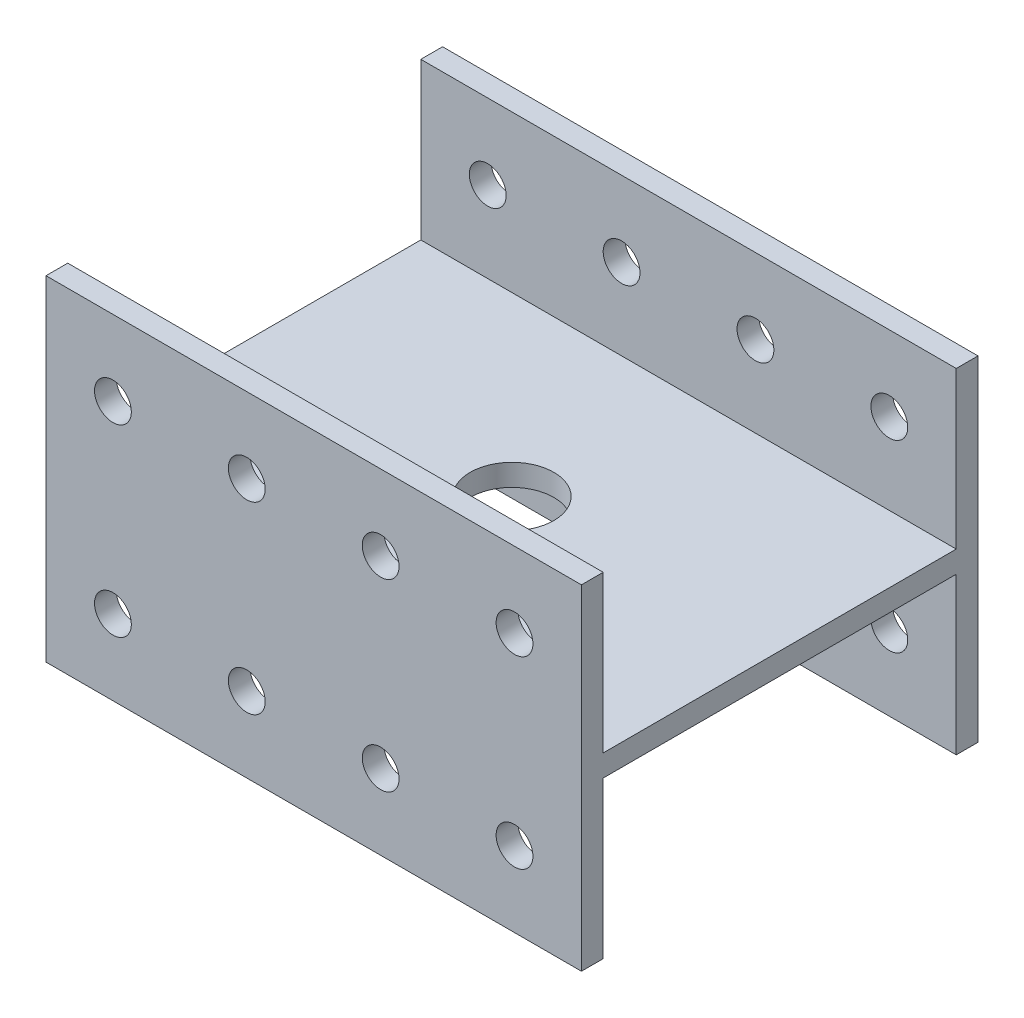
ISO-10303-21;
HEADER;
FILE_DESCRIPTION(('STEP AP214'),'2;1');
FILE_NAME('part.step','',(''),(''),'','','');
FILE_SCHEMA(('AUTOMOTIVE_DESIGN { 1 0 10303 214 1 1 1 1 }'));
ENDSEC;
DATA;
#1=APPLICATION_CONTEXT('core data for automotive mechanical design processes');
#2=APPLICATION_PROTOCOL_DEFINITION('international standard','automotive_design',2000,#1);
#3=PRODUCT_CONTEXT('',#1,'mechanical');
#4=PRODUCT('Part','Part','',(#3));
#5=PRODUCT_RELATED_PRODUCT_CATEGORY('part','',(#4));
#6=PRODUCT_DEFINITION_FORMATION('','',#4);
#7=PRODUCT_DEFINITION_CONTEXT('part definition',#1,'design');
#8=PRODUCT_DEFINITION('design','',#6,#7);
#9=PRODUCT_DEFINITION_SHAPE('','',#8);
#10=(LENGTH_UNIT() NAMED_UNIT(*) SI_UNIT(.MILLI.,.METRE.));
#11=(NAMED_UNIT(*) PLANE_ANGLE_UNIT() SI_UNIT($,.RADIAN.));
#12=(NAMED_UNIT(*) SI_UNIT($,.STERADIAN.) SOLID_ANGLE_UNIT());
#13=UNCERTAINTY_MEASURE_WITH_UNIT(LENGTH_MEASURE(1.E-05),#10,'distance_accuracy_value','');
#14=(GEOMETRIC_REPRESENTATION_CONTEXT(3) GLOBAL_UNCERTAINTY_ASSIGNED_CONTEXT((#13)) GLOBAL_UNIT_ASSIGNED_CONTEXT((#10,
#11,#12)) REPRESENTATION_CONTEXT('',''));
#15=CARTESIAN_POINT('',(0.,0.,0.));
#16=DIRECTION('',(0.,0.,1.));
#17=DIRECTION('',(1.,0.,0.));
#18=AXIS2_PLACEMENT_3D('',#15,#16,#17);
#19=CARTESIAN_POINT('',(0.,0.,237.));
#20=DIRECTION('',(0.,1.,0.));
#21=DIRECTION('',(0.,0.,1.));
#22=AXIS2_PLACEMENT_3D('',#19,#20,#21);
#23=PLANE('',#22);
#24=DIRECTION('',(0.,0.,-1.));
#25=VECTOR('',#24,1.);
#26=CARTESIAN_POINT('',(320.,0.,237.));
#27=LINE('',#26,#25);
#28=CARTESIAN_POINT('',(320.,0.,13.));
#29=VERTEX_POINT('',#28);
#30=CARTESIAN_POINT('',(320.,0.,0.));
#31=VERTEX_POINT('',#30);
#32=EDGE_CURVE('E138',#29,#31,#27,.T.);
#33=ORIENTED_EDGE('',*,*,#32,.F.);
#34=DIRECTION('',(-1.,0.,0.));
#35=VECTOR('',#34,1.);
#36=CARTESIAN_POINT('',(320.,0.,13.));
#37=LINE('',#36,#35);
#38=CARTESIAN_POINT('',(0.,0.,13.));
#39=VERTEX_POINT('',#38);
#40=EDGE_CURVE('E123',#29,#39,#37,.T.);
#41=ORIENTED_EDGE('',*,*,#40,.T.);
#42=DIRECTION('',(0.,0.,-1.));
#43=VECTOR('',#42,1.);
#44=CARTESIAN_POINT('',(0.,0.,237.));
#45=LINE('',#44,#43);
#46=CARTESIAN_POINT('',(0.,0.,0.));
#47=VERTEX_POINT('',#46);
#48=EDGE_CURVE('E151',#39,#47,#45,.T.);
#49=ORIENTED_EDGE('',*,*,#48,.T.);
#50=DIRECTION('',(1.,0.,0.));
#51=VECTOR('',#50,1.);
#52=CARTESIAN_POINT('',(0.,0.,0.));
#53=LINE('',#52,#51);
#54=EDGE_CURVE('E145',#47,#31,#53,.T.);
#55=ORIENTED_EDGE('',*,*,#54,.T.);
#56=EDGE_LOOP('',(#33,#41,#49,#55));
#57=FACE_BOUND('',#56,.T.);
#58=ADVANCED_FACE('F32',(#57),#23,.F.);
#59=CARTESIAN_POINT('',(40.,45.,0.));
#60=DIRECTION('',(0.,0.,1.));
#61=DIRECTION('',(1.,0.,0.));
#62=AXIS2_PLACEMENT_3D('',#59,#60,#61);
#63=CYLINDRICAL_SURFACE('',#62,11.);
#64=CARTESIAN_POINT('',(40.,45.,13.));
#65=DIRECTION('',(0.,0.,-1.));
#66=DIRECTION('',(-1.,0.,0.));
#67=AXIS2_PLACEMENT_3D('',#64,#65,#66);
#68=CIRCLE('',#67,11.);
#69=CARTESIAN_POINT('',(29.,45.,13.));
#70=VERTEX_POINT('',#69);
#71=EDGE_CURVE('E226',#70,#70,#68,.F.);
#72=ORIENTED_EDGE('',*,*,#71,.T.);
#73=EDGE_LOOP('',(#72));
#74=FACE_BOUND('',#73,.T.);
#75=CARTESIAN_POINT('',(40.,45.,0.));
#76=DIRECTION('',(0.,0.,1.));
#77=DIRECTION('',(1.,0.,0.));
#78=AXIS2_PLACEMENT_3D('',#75,#76,#77);
#79=CIRCLE('',#78,11.);
#80=CARTESIAN_POINT('',(51.,45.,0.));
#81=VERTEX_POINT('',#80);
#82=EDGE_CURVE('E274',#81,#81,#79,.T.);
#83=ORIENTED_EDGE('',*,*,#82,.F.);
#84=EDGE_LOOP('',(#83));
#85=FACE_BOUND('',#84,.T.);
#86=ADVANCED_FACE('F368',(#74,#85),#63,.F.);
#87=CARTESIAN_POINT('',(120.,45.,0.));
#88=DIRECTION('',(0.,0.,1.));
#89=DIRECTION('',(1.,0.,0.));
#90=AXIS2_PLACEMENT_3D('',#87,#88,#89);
#91=CYLINDRICAL_SURFACE('',#90,11.);
#92=CARTESIAN_POINT('',(120.,45.,13.));
#93=DIRECTION('',(0.,0.,-1.));
#94=DIRECTION('',(-1.,0.,0.));
#95=AXIS2_PLACEMENT_3D('',#92,#93,#94);
#96=CIRCLE('',#95,11.);
#97=CARTESIAN_POINT('',(109.,45.,13.));
#98=VERTEX_POINT('',#97);
#99=EDGE_CURVE('E213',#98,#98,#96,.F.);
#100=ORIENTED_EDGE('',*,*,#99,.T.);
#101=EDGE_LOOP('',(#100));
#102=FACE_BOUND('',#101,.T.);
#103=CARTESIAN_POINT('',(120.,45.,0.));
#104=DIRECTION('',(0.,0.,1.));
#105=DIRECTION('',(1.,0.,0.));
#106=AXIS2_PLACEMENT_3D('',#103,#104,#105);
#107=CIRCLE('',#106,11.);
#108=CARTESIAN_POINT('',(131.,45.,0.));
#109=VERTEX_POINT('',#108);
#110=EDGE_CURVE('E267',#109,#109,#107,.T.);
#111=ORIENTED_EDGE('',*,*,#110,.F.);
#112=EDGE_LOOP('',(#111));
#113=FACE_BOUND('',#112,.T.);
#114=ADVANCED_FACE('F373',(#102,#113),#91,.F.);
#115=CARTESIAN_POINT('',(200.,45.,0.));
#116=DIRECTION('',(0.,0.,1.));
#117=DIRECTION('',(1.,0.,0.));
#118=AXIS2_PLACEMENT_3D('',#115,#116,#117);
#119=CYLINDRICAL_SURFACE('',#118,11.);
#120=CARTESIAN_POINT('',(200.,45.,13.));
#121=DIRECTION('',(0.,0.,-1.));
#122=DIRECTION('',(-1.,0.,0.));
#123=AXIS2_PLACEMENT_3D('',#120,#121,#122);
#124=CIRCLE('',#123,11.);
#125=CARTESIAN_POINT('',(189.,45.,13.));
#126=VERTEX_POINT('',#125);
#127=EDGE_CURVE('E208',#126,#126,#124,.F.);
#128=ORIENTED_EDGE('',*,*,#127,.T.);
#129=EDGE_LOOP('',(#128));
#130=FACE_BOUND('',#129,.T.);
#131=CARTESIAN_POINT('',(200.,45.,0.));
#132=DIRECTION('',(0.,0.,1.));
#133=DIRECTION('',(1.,0.,0.));
#134=AXIS2_PLACEMENT_3D('',#131,#132,#133);
#135=CIRCLE('',#134,11.);
#136=CARTESIAN_POINT('',(211.,45.,0.));
#137=VERTEX_POINT('',#136);
#138=EDGE_CURVE('E160',#137,#137,#135,.T.);
#139=ORIENTED_EDGE('',*,*,#138,.F.);
#140=EDGE_LOOP('',(#139));
#141=FACE_BOUND('',#140,.T.);
#142=ADVANCED_FACE('F395',(#130,#141),#119,.F.);
#143=CARTESIAN_POINT('',(280.,45.,0.));
#144=DIRECTION('',(0.,0.,1.));
#145=DIRECTION('',(1.,0.,0.));
#146=AXIS2_PLACEMENT_3D('',#143,#144,#145);
#147=CYLINDRICAL_SURFACE('',#146,11.);
#148=CARTESIAN_POINT('',(280.,45.,13.));
#149=DIRECTION('',(0.,0.,-1.));
#150=DIRECTION('',(-1.,0.,0.));
#151=AXIS2_PLACEMENT_3D('',#148,#149,#150);
#152=CIRCLE('',#151,11.);
#153=CARTESIAN_POINT('',(269.,45.,13.));
#154=VERTEX_POINT('',#153);
#155=EDGE_CURVE('E206',#154,#154,#152,.F.);
#156=ORIENTED_EDGE('',*,*,#155,.T.);
#157=EDGE_LOOP('',(#156));
#158=FACE_BOUND('',#157,.T.);
#159=CARTESIAN_POINT('',(280.,45.,0.));
#160=DIRECTION('',(0.,0.,1.));
#161=DIRECTION('',(1.,0.,0.));
#162=AXIS2_PLACEMENT_3D('',#159,#160,#161);
#163=CIRCLE('',#162,11.);
#164=CARTESIAN_POINT('',(291.,45.,0.));
#165=VERTEX_POINT('',#164);
#166=EDGE_CURVE('E166',#165,#165,#163,.T.);
#167=ORIENTED_EDGE('',*,*,#166,.F.);
#168=EDGE_LOOP('',(#167));
#169=FACE_BOUND('',#168,.T.);
#170=ADVANCED_FACE('F400',(#158,#169),#147,.F.);
#171=CARTESIAN_POINT('',(0.,200.,237.));
#172=DIRECTION('',(0.,-1.,0.));
#173=DIRECTION('',(0.,0.,-1.));
#174=AXIS2_PLACEMENT_3D('',#171,#172,#173);
#175=PLANE('',#174);
#176=DIRECTION('',(0.,0.,-1.));
#177=VECTOR('',#176,1.);
#178=CARTESIAN_POINT('',(0.,200.,237.));
#179=LINE('',#178,#177);
#180=CARTESIAN_POINT('',(0.,200.,13.));
#181=VERTEX_POINT('',#180);
#182=CARTESIAN_POINT('',(0.,200.,0.));
#183=VERTEX_POINT('',#182);
#184=EDGE_CURVE('E290',#181,#183,#179,.T.);
#185=ORIENTED_EDGE('',*,*,#184,.F.);
#186=DIRECTION('',(-1.,0.,0.));
#187=VECTOR('',#186,1.);
#188=CARTESIAN_POINT('',(320.,200.,13.));
#189=LINE('',#188,#187);
#190=CARTESIAN_POINT('',(320.,200.,13.));
#191=VERTEX_POINT('',#190);
#192=EDGE_CURVE('E196',#191,#181,#189,.T.);
#193=ORIENTED_EDGE('',*,*,#192,.F.);
#194=DIRECTION('',(0.,0.,-1.));
#195=VECTOR('',#194,1.);
#196=CARTESIAN_POINT('',(320.,200.,237.));
#197=LINE('',#196,#195);
#198=CARTESIAN_POINT('',(320.,200.,0.));
#199=VERTEX_POINT('',#198);
#200=EDGE_CURVE('E153',#191,#199,#197,.T.);
#201=ORIENTED_EDGE('',*,*,#200,.T.);
#202=DIRECTION('',(-1.,0.,0.));
#203=VECTOR('',#202,1.);
#204=CARTESIAN_POINT('',(0.,200.,0.));
#205=LINE('',#204,#203);
#206=EDGE_CURVE('E284',#199,#183,#205,.T.);
#207=ORIENTED_EDGE('',*,*,#206,.T.);
#208=EDGE_LOOP('',(#185,#193,#201,#207));
#209=FACE_BOUND('',#208,.T.);
#210=ADVANCED_FACE('F310',(#209),#175,.F.);
#211=CARTESIAN_POINT('',(40.,155.,0.));
#212=DIRECTION('',(0.,0.,1.));
#213=DIRECTION('',(1.,0.,0.));
#214=AXIS2_PLACEMENT_3D('',#211,#212,#213);
#215=CYLINDRICAL_SURFACE('',#214,11.);
#216=CARTESIAN_POINT('',(40.,155.,13.));
#217=DIRECTION('',(0.,0.,-1.));
#218=DIRECTION('',(0.,1.,0.));
#219=AXIS2_PLACEMENT_3D('',#216,#217,#218);
#220=CIRCLE('',#219,11.);
#221=CARTESIAN_POINT('',(40.,166.,13.));
#222=VERTEX_POINT('',#221);
#223=EDGE_CURVE('E264',#222,#222,#220,.F.);
#224=ORIENTED_EDGE('',*,*,#223,.T.);
#225=EDGE_LOOP('',(#224));
#226=FACE_BOUND('',#225,.T.);
#227=CARTESIAN_POINT('',(40.,155.,0.));
#228=DIRECTION('',(0.,0.,1.));
#229=DIRECTION('',(1.,0.,0.));
#230=AXIS2_PLACEMENT_3D('',#227,#228,#229);
#231=CIRCLE('',#230,11.);
#232=CARTESIAN_POINT('',(51.,155.,0.));
#233=VERTEX_POINT('',#232);
#234=EDGE_CURVE('E172',#233,#233,#231,.T.);
#235=ORIENTED_EDGE('',*,*,#234,.F.);
#236=EDGE_LOOP('',(#235));
#237=FACE_BOUND('',#236,.T.);
#238=ADVANCED_FACE('F405',(#226,#237),#215,.F.);
#239=CARTESIAN_POINT('',(120.,155.,0.));
#240=DIRECTION('',(0.,0.,1.));
#241=DIRECTION('',(1.,0.,0.));
#242=AXIS2_PLACEMENT_3D('',#239,#240,#241);
#243=CYLINDRICAL_SURFACE('',#242,11.);
#244=CARTESIAN_POINT('',(120.,155.,13.));
#245=DIRECTION('',(0.,0.,-1.));
#246=DIRECTION('',(0.,1.,0.));
#247=AXIS2_PLACEMENT_3D('',#244,#245,#246);
#248=CIRCLE('',#247,11.);
#249=CARTESIAN_POINT('',(120.,166.,13.));
#250=VERTEX_POINT('',#249);
#251=EDGE_CURVE('E261',#250,#250,#248,.F.);
#252=ORIENTED_EDGE('',*,*,#251,.T.);
#253=EDGE_LOOP('',(#252));
#254=FACE_BOUND('',#253,.T.);
#255=CARTESIAN_POINT('',(120.,155.,0.));
#256=DIRECTION('',(0.,0.,1.));
#257=DIRECTION('',(1.,0.,0.));
#258=AXIS2_PLACEMENT_3D('',#255,#256,#257);
#259=CIRCLE('',#258,11.);
#260=CARTESIAN_POINT('',(131.,155.,0.));
#261=VERTEX_POINT('',#260);
#262=EDGE_CURVE('E178',#261,#261,#259,.T.);
#263=ORIENTED_EDGE('',*,*,#262,.F.);
#264=EDGE_LOOP('',(#263));
#265=FACE_BOUND('',#264,.T.);
#266=ADVANCED_FACE('F409',(#254,#265),#243,.F.);
#267=CARTESIAN_POINT('',(200.,155.,0.));
#268=DIRECTION('',(0.,0.,1.));
#269=DIRECTION('',(1.,0.,0.));
#270=AXIS2_PLACEMENT_3D('',#267,#268,#269);
#271=CYLINDRICAL_SURFACE('',#270,11.);
#272=CARTESIAN_POINT('',(200.,155.,13.));
#273=DIRECTION('',(0.,0.,-1.));
#274=DIRECTION('',(0.,1.,0.));
#275=AXIS2_PLACEMENT_3D('',#272,#273,#274);
#276=CIRCLE('',#275,11.);
#277=CARTESIAN_POINT('',(200.,166.,13.));
#278=VERTEX_POINT('',#277);
#279=EDGE_CURVE('E200',#278,#278,#276,.F.);
#280=ORIENTED_EDGE('',*,*,#279,.T.);
#281=EDGE_LOOP('',(#280));
#282=FACE_BOUND('',#281,.T.);
#283=CARTESIAN_POINT('',(200.,155.,0.));
#284=DIRECTION('',(0.,0.,1.));
#285=DIRECTION('',(1.,0.,0.));
#286=AXIS2_PLACEMENT_3D('',#283,#284,#285);
#287=CIRCLE('',#286,11.);
#288=CARTESIAN_POINT('',(211.,155.,0.));
#289=VERTEX_POINT('',#288);
#290=EDGE_CURVE('E184',#289,#289,#287,.T.);
#291=ORIENTED_EDGE('',*,*,#290,.F.);
#292=EDGE_LOOP('',(#291));
#293=FACE_BOUND('',#292,.T.);
#294=ADVANCED_FACE('F388',(#282,#293),#271,.F.);
#295=CARTESIAN_POINT('',(280.,155.,0.));
#296=DIRECTION('',(0.,0.,1.));
#297=DIRECTION('',(1.,0.,0.));
#298=AXIS2_PLACEMENT_3D('',#295,#296,#297);
#299=CYLINDRICAL_SURFACE('',#298,11.);
#300=CARTESIAN_POINT('',(280.,155.,13.));
#301=DIRECTION('',(0.,0.,-1.));
#302=DIRECTION('',(0.,1.,0.));
#303=AXIS2_PLACEMENT_3D('',#300,#301,#302);
#304=CIRCLE('',#303,11.);
#305=CARTESIAN_POINT('',(280.,166.,13.));
#306=VERTEX_POINT('',#305);
#307=EDGE_CURVE('E197',#306,#306,#304,.F.);
#308=ORIENTED_EDGE('',*,*,#307,.T.);
#309=EDGE_LOOP('',(#308));
#310=FACE_BOUND('',#309,.T.);
#311=CARTESIAN_POINT('',(280.,155.,0.));
#312=DIRECTION('',(0.,0.,1.));
#313=DIRECTION('',(1.,0.,0.));
#314=AXIS2_PLACEMENT_3D('',#311,#312,#313);
#315=CIRCLE('',#314,11.);
#316=CARTESIAN_POINT('',(291.,155.,0.));
#317=VERTEX_POINT('',#316);
#318=EDGE_CURVE('E41',#317,#317,#315,.T.);
#319=ORIENTED_EDGE('',*,*,#318,.F.);
#320=EDGE_LOOP('',(#319));
#321=FACE_BOUND('',#320,.T.);
#322=ADVANCED_FACE('F384',(#310,#321),#299,.F.);
#323=CARTESIAN_POINT('',(0.,200.,237.));
#324=DIRECTION('',(1.,0.,0.));
#325=DIRECTION('',(0.,0.,-1.));
#326=AXIS2_PLACEMENT_3D('',#323,#324,#325);
#327=PLANE('',#326);
#328=ORIENTED_EDGE('',*,*,#48,.F.);
#329=DIRECTION('',(0.,-1.,0.));
#330=VECTOR('',#329,1.);
#331=CARTESIAN_POINT('',(0.,0.,13.));
#332=LINE('',#331,#330);
#333=CARTESIAN_POINT('',(0.,93.5,13.));
#334=VERTEX_POINT('',#333);
#335=EDGE_CURVE('E129',#334,#39,#332,.T.);
#336=ORIENTED_EDGE('',*,*,#335,.F.);
#337=DIRECTION('',(0.,0.,-1.));
#338=VECTOR('',#337,1.);
#339=CARTESIAN_POINT('',(0.,93.5,13.));
#340=LINE('',#339,#338);
#341=CARTESIAN_POINT('',(0.,93.5,224.));
#342=VERTEX_POINT('',#341);
#343=EDGE_CURVE('E142',#342,#334,#340,.T.);
#344=ORIENTED_EDGE('',*,*,#343,.F.);
#345=DIRECTION('',(0.,1.,0.));
#346=VECTOR('',#345,1.);
#347=CARTESIAN_POINT('',(0.,0.,224.));
#348=LINE('',#347,#346);
#349=CARTESIAN_POINT('',(0.,0.,224.));
#350=VERTEX_POINT('',#349);
#351=EDGE_CURVE('E579',#350,#342,#348,.T.);
#352=ORIENTED_EDGE('',*,*,#351,.F.);
#353=CARTESIAN_POINT('',(0.,0.,237.));
#354=VERTEX_POINT('',#353);
#355=EDGE_CURVE('E157',#354,#350,#45,.T.);
#356=ORIENTED_EDGE('',*,*,#355,.F.);
#357=DIRECTION('',(0.,-1.,0.));
#358=VECTOR('',#357,1.);
#359=CARTESIAN_POINT('',(0.,200.,237.));
#360=LINE('',#359,#358);
#361=CARTESIAN_POINT('',(0.,200.,237.));
#362=VERTEX_POINT('',#361);
#363=EDGE_CURVE('E280',#362,#354,#360,.T.);
#364=ORIENTED_EDGE('',*,*,#363,.F.);
#365=CARTESIAN_POINT('',(0.,200.,224.));
#366=VERTEX_POINT('',#365);
#367=EDGE_CURVE('E297',#362,#366,#179,.T.);
#368=ORIENTED_EDGE('',*,*,#367,.T.);
#369=DIRECTION('',(0.,1.,0.));
#370=VECTOR('',#369,1.);
#371=CARTESIAN_POINT('',(0.,200.,224.));
#372=LINE('',#371,#370);
#373=CARTESIAN_POINT('',(0.,106.5,224.));
#374=VERTEX_POINT('',#373);
#375=EDGE_CURVE('E57',#374,#366,#372,.T.);
#376=ORIENTED_EDGE('',*,*,#375,.F.);
#377=DIRECTION('',(0.,0.,1.));
#378=VECTOR('',#377,1.);
#379=CARTESIAN_POINT('',(0.,106.5,13.));
#380=LINE('',#379,#378);
#381=CARTESIAN_POINT('',(0.,106.5,13.));
#382=VERTEX_POINT('',#381);
#383=EDGE_CURVE('E242',#382,#374,#380,.T.);
#384=ORIENTED_EDGE('',*,*,#383,.F.);
#385=DIRECTION('',(0.,-1.,0.));
#386=VECTOR('',#385,1.);
#387=CARTESIAN_POINT('',(0.,200.,13.));
#388=LINE('',#387,#386);
#389=EDGE_CURVE('E229',#181,#382,#388,.T.);
#390=ORIENTED_EDGE('',*,*,#389,.F.);
#391=ORIENTED_EDGE('',*,*,#184,.T.);
#392=DIRECTION('',(0.,-1.,0.));
#393=VECTOR('',#392,1.);
#394=CARTESIAN_POINT('',(0.,200.,0.));
#395=LINE('',#394,#393);
#396=EDGE_CURVE('E277',#183,#47,#395,.T.);
#397=ORIENTED_EDGE('',*,*,#396,.T.);
#398=EDGE_LOOP('',(#328,#336,#344,#352,#356,#364,#368,#376,#384,#390,#391,#397));
#399=FACE_BOUND('',#398,.T.);
#400=ADVANCED_FACE('F304',(#399),#327,.F.);
#401=ORIENTED_EDGE('',*,*,#355,.T.);
#402=DIRECTION('',(-1.,0.,0.));
#403=VECTOR('',#402,1.);
#404=CARTESIAN_POINT('',(320.,0.,224.));
#405=LINE('',#404,#403);
#406=CARTESIAN_POINT('',(320.,0.,224.));
#407=VERTEX_POINT('',#406);
#408=EDGE_CURVE('E133',#407,#350,#405,.T.);
#409=ORIENTED_EDGE('',*,*,#408,.F.);
#410=CARTESIAN_POINT('',(320.,0.,237.));
#411=VERTEX_POINT('',#410);
#412=EDGE_CURVE('E147',#411,#407,#27,.T.);
#413=ORIENTED_EDGE('',*,*,#412,.F.);
#414=DIRECTION('',(1.,0.,0.));
#415=VECTOR('',#414,1.);
#416=CARTESIAN_POINT('',(0.,0.,237.));
#417=LINE('',#416,#415);
#418=EDGE_CURVE('E283',#354,#411,#417,.T.);
#419=ORIENTED_EDGE('',*,*,#418,.F.);
#420=EDGE_LOOP('',(#401,#409,#413,#419));
#421=FACE_BOUND('',#420,.T.);
#422=ADVANCED_FACE('F336',(#421),#23,.F.);
#423=CARTESIAN_POINT('',(320.,200.,237.));
#424=DIRECTION('',(-1.,0.,0.));
#425=DIRECTION('',(0.,-1.,0.));
#426=AXIS2_PLACEMENT_3D('',#423,#424,#425);
#427=PLANE('',#426);
#428=DIRECTION('',(0.,0.,-1.));
#429=VECTOR('',#428,1.);
#430=CARTESIAN_POINT('',(320.,93.5,13.));
#431=LINE('',#430,#429);
#432=CARTESIAN_POINT('',(320.,93.5,224.));
#433=VERTEX_POINT('',#432);
#434=CARTESIAN_POINT('',(320.,93.5,13.));
#435=VERTEX_POINT('',#434);
#436=EDGE_CURVE('E49',#433,#435,#431,.T.);
#437=ORIENTED_EDGE('',*,*,#436,.T.);
#438=DIRECTION('',(0.,-1.,0.));
#439=VECTOR('',#438,1.);
#440=CARTESIAN_POINT('',(320.,0.,13.));
#441=LINE('',#440,#439);
#442=EDGE_CURVE('E127',#435,#29,#441,.T.);
#443=ORIENTED_EDGE('',*,*,#442,.T.);
#444=ORIENTED_EDGE('',*,*,#32,.T.);
#445=DIRECTION('',(0.,1.,0.));
#446=VECTOR('',#445,1.);
#447=CARTESIAN_POINT('',(320.,200.,0.));
#448=LINE('',#447,#446);
#449=EDGE_CURVE('E294',#31,#199,#448,.T.);
#450=ORIENTED_EDGE('',*,*,#449,.T.);
#451=ORIENTED_EDGE('',*,*,#200,.F.);
#452=DIRECTION('',(0.,-1.,0.));
#453=VECTOR('',#452,1.);
#454=CARTESIAN_POINT('',(320.,200.,13.));
#455=LINE('',#454,#453);
#456=CARTESIAN_POINT('',(320.,106.5,13.));
#457=VERTEX_POINT('',#456);
#458=EDGE_CURVE('E230',#191,#457,#455,.T.);
#459=ORIENTED_EDGE('',*,*,#458,.T.);
#460=DIRECTION('',(0.,0.,1.));
#461=VECTOR('',#460,1.);
#462=CARTESIAN_POINT('',(320.,106.5,13.));
#463=LINE('',#462,#461);
#464=CARTESIAN_POINT('',(320.,106.5,224.));
#465=VERTEX_POINT('',#464);
#466=EDGE_CURVE('E233',#457,#465,#463,.T.);
#467=ORIENTED_EDGE('',*,*,#466,.T.);
#468=DIRECTION('',(0.,1.,0.));
#469=VECTOR('',#468,1.);
#470=CARTESIAN_POINT('',(320.,200.,224.));
#471=LINE('',#470,#469);
#472=CARTESIAN_POINT('',(320.,200.,224.));
#473=VERTEX_POINT('',#472);
#474=EDGE_CURVE('E236',#465,#473,#471,.T.);
#475=ORIENTED_EDGE('',*,*,#474,.T.);
#476=CARTESIAN_POINT('',(320.,200.,237.));
#477=VERTEX_POINT('',#476);
#478=EDGE_CURVE('E148',#477,#473,#197,.T.);
#479=ORIENTED_EDGE('',*,*,#478,.F.);
#480=DIRECTION('',(0.,1.,0.));
#481=VECTOR('',#480,1.);
#482=CARTESIAN_POINT('',(320.,200.,237.));
#483=LINE('',#482,#481);
#484=EDGE_CURVE('E286',#411,#477,#483,.T.);
#485=ORIENTED_EDGE('',*,*,#484,.F.);
#486=ORIENTED_EDGE('',*,*,#412,.T.);
#487=DIRECTION('',(0.,1.,0.));
#488=VECTOR('',#487,1.);
#489=CARTESIAN_POINT('',(320.,0.,224.));
#490=LINE('',#489,#488);
#491=EDGE_CURVE('E141',#407,#433,#490,.T.);
#492=ORIENTED_EDGE('',*,*,#491,.T.);
#493=EDGE_LOOP('',(#437,#443,#444,#450,#451,#459,#467,#475,#479,#485,#486,#492));
#494=FACE_BOUND('',#493,.T.);
#495=ADVANCED_FACE('F136',(#494),#427,.F.);
#496=ORIENTED_EDGE('',*,*,#478,.T.);
#497=DIRECTION('',(-1.,0.,0.));
#498=VECTOR('',#497,1.);
#499=CARTESIAN_POINT('',(320.,200.,224.));
#500=LINE('',#499,#498);
#501=EDGE_CURVE('E247',#473,#366,#500,.T.);
#502=ORIENTED_EDGE('',*,*,#501,.T.);
#503=ORIENTED_EDGE('',*,*,#367,.F.);
#504=DIRECTION('',(-1.,0.,0.));
#505=VECTOR('',#504,1.);
#506=CARTESIAN_POINT('',(0.,200.,237.));
#507=LINE('',#506,#505);
#508=EDGE_CURVE('E288',#477,#362,#507,.T.);
#509=ORIENTED_EDGE('',*,*,#508,.F.);
#510=EDGE_LOOP('',(#496,#502,#503,#509));
#511=FACE_BOUND('',#510,.T.);
#512=ADVANCED_FACE('F328',(#511),#175,.F.);
#513=CARTESIAN_POINT('',(0.,0.,237.));
#514=DIRECTION('',(0.,0.,1.));
#515=DIRECTION('',(1.,0.,0.));
#516=AXIS2_PLACEMENT_3D('',#513,#514,#515);
#517=PLANE('',#516);
#518=CARTESIAN_POINT('',(120.,45.,237.));
#519=DIRECTION('',(0.,0.,1.));
#520=DIRECTION('',(1.,0.,0.));
#521=AXIS2_PLACEMENT_3D('',#518,#519,#520);
#522=CIRCLE('',#521,11.);
#523=CARTESIAN_POINT('',(131.,45.,237.));
#524=VERTEX_POINT('',#523);
#525=EDGE_CURVE('E270',#524,#524,#522,.T.);
#526=ORIENTED_EDGE('',*,*,#525,.F.);
#527=EDGE_LOOP('',(#526));
#528=FACE_BOUND('',#527,.T.);
#529=CARTESIAN_POINT('',(40.,45.,237.));
#530=DIRECTION('',(0.,0.,1.));
#531=DIRECTION('',(1.,0.,0.));
#532=AXIS2_PLACEMENT_3D('',#529,#530,#531);
#533=CIRCLE('',#532,11.);
#534=CARTESIAN_POINT('',(51.,45.,237.));
#535=VERTEX_POINT('',#534);
#536=EDGE_CURVE('E273',#535,#535,#533,.T.);
#537=ORIENTED_EDGE('',*,*,#536,.F.);
#538=EDGE_LOOP('',(#537));
#539=FACE_BOUND('',#538,.T.);
#540=ORIENTED_EDGE('',*,*,#363,.T.);
#541=ORIENTED_EDGE('',*,*,#418,.T.);
#542=ORIENTED_EDGE('',*,*,#484,.T.);
#543=ORIENTED_EDGE('',*,*,#508,.T.);
#544=EDGE_LOOP('',(#540,#541,#542,#543));
#545=FACE_BOUND('',#544,.T.);
#546=CARTESIAN_POINT('',(200.,45.,237.));
#547=DIRECTION('',(0.,0.,1.));
#548=DIRECTION('',(1.,0.,0.));
#549=AXIS2_PLACEMENT_3D('',#546,#547,#548);
#550=CIRCLE('',#549,11.);
#551=CARTESIAN_POINT('',(211.,45.,237.));
#552=VERTEX_POINT('',#551);
#553=EDGE_CURVE('E163',#552,#552,#550,.T.);
#554=ORIENTED_EDGE('',*,*,#553,.F.);
#555=EDGE_LOOP('',(#554));
#556=FACE_BOUND('',#555,.T.);
#557=CARTESIAN_POINT('',(280.,45.,237.));
#558=DIRECTION('',(0.,0.,1.));
#559=DIRECTION('',(1.,0.,0.));
#560=AXIS2_PLACEMENT_3D('',#557,#558,#559);
#561=CIRCLE('',#560,11.);
#562=CARTESIAN_POINT('',(291.,45.,237.));
#563=VERTEX_POINT('',#562);
#564=EDGE_CURVE('E169',#563,#563,#561,.T.);
#565=ORIENTED_EDGE('',*,*,#564,.F.);
#566=EDGE_LOOP('',(#565));
#567=FACE_BOUND('',#566,.T.);
#568=CARTESIAN_POINT('',(40.,155.,237.));
#569=DIRECTION('',(0.,0.,1.));
#570=DIRECTION('',(1.,0.,0.));
#571=AXIS2_PLACEMENT_3D('',#568,#569,#570);
#572=CIRCLE('',#571,11.);
#573=CARTESIAN_POINT('',(51.,155.,237.));
#574=VERTEX_POINT('',#573);
#575=EDGE_CURVE('E175',#574,#574,#572,.T.);
#576=ORIENTED_EDGE('',*,*,#575,.F.);
#577=EDGE_LOOP('',(#576));
#578=FACE_BOUND('',#577,.T.);
#579=CARTESIAN_POINT('',(120.,155.,237.));
#580=DIRECTION('',(0.,0.,1.));
#581=DIRECTION('',(1.,0.,0.));
#582=AXIS2_PLACEMENT_3D('',#579,#580,#581);
#583=CIRCLE('',#582,11.);
#584=CARTESIAN_POINT('',(131.,155.,237.));
#585=VERTEX_POINT('',#584);
#586=EDGE_CURVE('E181',#585,#585,#583,.T.);
#587=ORIENTED_EDGE('',*,*,#586,.F.);
#588=EDGE_LOOP('',(#587));
#589=FACE_BOUND('',#588,.T.);
#590=CARTESIAN_POINT('',(200.,155.,237.));
#591=DIRECTION('',(0.,0.,1.));
#592=DIRECTION('',(1.,0.,0.));
#593=AXIS2_PLACEMENT_3D('',#590,#591,#592);
#594=CIRCLE('',#593,11.);
#595=CARTESIAN_POINT('',(211.,155.,237.));
#596=VERTEX_POINT('',#595);
#597=EDGE_CURVE('E187',#596,#596,#594,.T.);
#598=ORIENTED_EDGE('',*,*,#597,.F.);
#599=EDGE_LOOP('',(#598));
#600=FACE_BOUND('',#599,.T.);
#601=CARTESIAN_POINT('',(280.,155.,237.));
#602=DIRECTION('',(0.,0.,1.));
#603=DIRECTION('',(1.,0.,0.));
#604=AXIS2_PLACEMENT_3D('',#601,#602,#603);
#605=CIRCLE('',#604,11.);
#606=CARTESIAN_POINT('',(291.,155.,237.));
#607=VERTEX_POINT('',#606);
#608=EDGE_CURVE('E11',#607,#607,#605,.T.);
#609=ORIENTED_EDGE('',*,*,#608,.F.);
#610=EDGE_LOOP('',(#609));
#611=FACE_BOUND('',#610,.T.);
#612=ADVANCED_FACE('F330',(#528,#539,#545,#556,#567,#578,#589,#600,#611),#517,.T.);
#613=CARTESIAN_POINT('',(0.,0.,0.));
#614=DIRECTION('',(0.,0.,1.));
#615=DIRECTION('',(1.,0.,0.));
#616=AXIS2_PLACEMENT_3D('',#613,#614,#615);
#617=PLANE('',#616);
#618=ORIENTED_EDGE('',*,*,#110,.T.);
#619=EDGE_LOOP('',(#618));
#620=FACE_BOUND('',#619,.T.);
#621=ORIENTED_EDGE('',*,*,#82,.T.);
#622=EDGE_LOOP('',(#621));
#623=FACE_BOUND('',#622,.T.);
#624=ORIENTED_EDGE('',*,*,#396,.F.);
#625=ORIENTED_EDGE('',*,*,#206,.F.);
#626=ORIENTED_EDGE('',*,*,#449,.F.);
#627=ORIENTED_EDGE('',*,*,#54,.F.);
#628=EDGE_LOOP('',(#624,#625,#626,#627));
#629=FACE_BOUND('',#628,.T.);
#630=ORIENTED_EDGE('',*,*,#138,.T.);
#631=EDGE_LOOP('',(#630));
#632=FACE_BOUND('',#631,.T.);
#633=ORIENTED_EDGE('',*,*,#166,.T.);
#634=EDGE_LOOP('',(#633));
#635=FACE_BOUND('',#634,.T.);
#636=ORIENTED_EDGE('',*,*,#234,.T.);
#637=EDGE_LOOP('',(#636));
#638=FACE_BOUND('',#637,.T.);
#639=ORIENTED_EDGE('',*,*,#262,.T.);
#640=EDGE_LOOP('',(#639));
#641=FACE_BOUND('',#640,.T.);
#642=ORIENTED_EDGE('',*,*,#290,.T.);
#643=EDGE_LOOP('',(#642));
#644=FACE_BOUND('',#643,.T.);
#645=ORIENTED_EDGE('',*,*,#318,.T.);
#646=EDGE_LOOP('',(#645));
#647=FACE_BOUND('',#646,.T.);
#648=ADVANCED_FACE('F313',(#620,#623,#629,#632,#635,#638,#641,#644,#647),#617,.F.);
#649=CARTESIAN_POINT('',(40.,45.,224.));
#650=DIRECTION('',(0.,0.,1.));
#651=DIRECTION('',(0.,-1.,0.));
#652=AXIS2_PLACEMENT_3D('',#649,#650,#651);
#653=CIRCLE('',#652,11.);
#654=CARTESIAN_POINT('',(40.,34.,224.));
#655=VERTEX_POINT('',#654);
#656=EDGE_CURVE('E209',#655,#655,#653,.F.);
#657=ORIENTED_EDGE('',*,*,#656,.T.);
#658=EDGE_LOOP('',(#657));
#659=FACE_BOUND('',#658,.T.);
#660=ORIENTED_EDGE('',*,*,#536,.T.);
#661=EDGE_LOOP('',(#660));
#662=FACE_BOUND('',#661,.T.);
#663=ADVANCED_FACE('F376',(#659,#662),#63,.F.);
#664=CARTESIAN_POINT('',(120.,45.,224.));
#665=DIRECTION('',(0.,0.,1.));
#666=DIRECTION('',(0.,-1.,0.));
#667=AXIS2_PLACEMENT_3D('',#664,#665,#666);
#668=CIRCLE('',#667,11.);
#669=CARTESIAN_POINT('',(120.,34.,224.));
#670=VERTEX_POINT('',#669);
#671=EDGE_CURVE('E216',#670,#670,#668,.F.);
#672=ORIENTED_EDGE('',*,*,#671,.T.);
#673=EDGE_LOOP('',(#672));
#674=FACE_BOUND('',#673,.T.);
#675=ORIENTED_EDGE('',*,*,#525,.T.);
#676=EDGE_LOOP('',(#675));
#677=FACE_BOUND('',#676,.T.);
#678=ADVANCED_FACE('F394',(#674,#677),#91,.F.);
#679=CARTESIAN_POINT('',(200.,45.,224.));
#680=DIRECTION('',(0.,0.,1.));
#681=DIRECTION('',(0.,-1.,0.));
#682=AXIS2_PLACEMENT_3D('',#679,#680,#681);
#683=CIRCLE('',#682,11.);
#684=CARTESIAN_POINT('',(200.,34.,224.));
#685=VERTEX_POINT('',#684);
#686=EDGE_CURVE('E204',#685,#685,#683,.F.);
#687=ORIENTED_EDGE('',*,*,#686,.T.);
#688=EDGE_LOOP('',(#687));
#689=FACE_BOUND('',#688,.T.);
#690=ORIENTED_EDGE('',*,*,#553,.T.);
#691=EDGE_LOOP('',(#690));
#692=FACE_BOUND('',#691,.T.);
#693=ADVANCED_FACE('F347',(#689,#692),#119,.F.);
#694=CARTESIAN_POINT('',(280.,45.,224.));
#695=DIRECTION('',(0.,0.,1.));
#696=DIRECTION('',(0.,-1.,0.));
#697=AXIS2_PLACEMENT_3D('',#694,#695,#696);
#698=CIRCLE('',#697,11.);
#699=CARTESIAN_POINT('',(280.,34.,224.));
#700=VERTEX_POINT('',#699);
#701=EDGE_CURVE('E202',#700,#700,#698,.F.);
#702=ORIENTED_EDGE('',*,*,#701,.T.);
#703=EDGE_LOOP('',(#702));
#704=FACE_BOUND('',#703,.T.);
#705=ORIENTED_EDGE('',*,*,#564,.T.);
#706=EDGE_LOOP('',(#705));
#707=FACE_BOUND('',#706,.T.);
#708=ADVANCED_FACE('F393',(#704,#707),#147,.F.);
#709=CARTESIAN_POINT('',(40.,155.,224.));
#710=DIRECTION('',(0.,0.,1.));
#711=DIRECTION('',(0.,-1.,0.));
#712=AXIS2_PLACEMENT_3D('',#709,#710,#711);
#713=CIRCLE('',#712,11.);
#714=CARTESIAN_POINT('',(40.,144.,224.));
#715=VERTEX_POINT('',#714);
#716=EDGE_CURVE('E201',#715,#715,#713,.F.);
#717=ORIENTED_EDGE('',*,*,#716,.T.);
#718=EDGE_LOOP('',(#717));
#719=FACE_BOUND('',#718,.T.);
#720=ORIENTED_EDGE('',*,*,#575,.T.);
#721=EDGE_LOOP('',(#720));
#722=FACE_BOUND('',#721,.T.);
#723=ADVANCED_FACE('F398',(#719,#722),#215,.F.);
#724=CARTESIAN_POINT('',(120.,155.,224.));
#725=DIRECTION('',(0.,0.,1.));
#726=DIRECTION('',(0.,-1.,0.));
#727=AXIS2_PLACEMENT_3D('',#724,#725,#726);
#728=CIRCLE('',#727,11.);
#729=CARTESIAN_POINT('',(120.,144.,224.));
#730=VERTEX_POINT('',#729);
#731=EDGE_CURVE('E254',#730,#730,#728,.F.);
#732=ORIENTED_EDGE('',*,*,#731,.T.);
#733=EDGE_LOOP('',(#732));
#734=FACE_BOUND('',#733,.T.);
#735=ORIENTED_EDGE('',*,*,#586,.T.);
#736=EDGE_LOOP('',(#735));
#737=FACE_BOUND('',#736,.T.);
#738=ADVANCED_FACE('F403',(#734,#737),#243,.F.);
#739=CARTESIAN_POINT('',(200.,155.,224.));
#740=DIRECTION('',(0.,0.,1.));
#741=DIRECTION('',(0.,-1.,0.));
#742=AXIS2_PLACEMENT_3D('',#739,#740,#741);
#743=CIRCLE('',#742,11.);
#744=CARTESIAN_POINT('',(200.,144.,224.));
#745=VERTEX_POINT('',#744);
#746=EDGE_CURVE('E195',#745,#745,#743,.F.);
#747=ORIENTED_EDGE('',*,*,#746,.T.);
#748=EDGE_LOOP('',(#747));
#749=FACE_BOUND('',#748,.T.);
#750=ORIENTED_EDGE('',*,*,#597,.T.);
#751=EDGE_LOOP('',(#750));
#752=FACE_BOUND('',#751,.T.);
#753=ADVANCED_FACE('F407',(#749,#752),#271,.F.);
#754=CARTESIAN_POINT('',(280.,155.,224.));
#755=DIRECTION('',(0.,0.,1.));
#756=DIRECTION('',(0.,-1.,0.));
#757=AXIS2_PLACEMENT_3D('',#754,#755,#756);
#758=CIRCLE('',#757,11.);
#759=CARTESIAN_POINT('',(280.,144.,224.));
#760=VERTEX_POINT('',#759);
#761=EDGE_CURVE('E192',#760,#760,#758,.F.);
#762=ORIENTED_EDGE('',*,*,#761,.T.);
#763=EDGE_LOOP('',(#762));
#764=FACE_BOUND('',#763,.T.);
#765=ORIENTED_EDGE('',*,*,#608,.T.);
#766=EDGE_LOOP('',(#765));
#767=FACE_BOUND('',#766,.T.);
#768=ADVANCED_FACE('F34',(#764,#767),#299,.F.);
#769=CARTESIAN_POINT('',(320.,200.,13.));
#770=DIRECTION('',(0.,0.,-1.));
#771=DIRECTION('',(0.,1.,0.));
#772=AXIS2_PLACEMENT_3D('',#769,#770,#771);
#773=PLANE('',#772);
#774=ORIENTED_EDGE('',*,*,#251,.F.);
#775=EDGE_LOOP('',(#774));
#776=FACE_BOUND('',#775,.T.);
#777=ORIENTED_EDGE('',*,*,#307,.F.);
#778=EDGE_LOOP('',(#777));
#779=FACE_BOUND('',#778,.T.);
#780=ORIENTED_EDGE('',*,*,#389,.T.);
#781=DIRECTION('',(-1.,0.,0.));
#782=VECTOR('',#781,1.);
#783=CARTESIAN_POINT('',(320.,106.5,13.));
#784=LINE('',#783,#782);
#785=EDGE_CURVE('E239',#457,#382,#784,.T.);
#786=ORIENTED_EDGE('',*,*,#785,.F.);
#787=ORIENTED_EDGE('',*,*,#458,.F.);
#788=ORIENTED_EDGE('',*,*,#192,.T.);
#789=EDGE_LOOP('',(#780,#786,#787,#788));
#790=FACE_BOUND('',#789,.T.);
#791=ORIENTED_EDGE('',*,*,#279,.F.);
#792=EDGE_LOOP('',(#791));
#793=FACE_BOUND('',#792,.T.);
#794=ORIENTED_EDGE('',*,*,#223,.F.);
#795=EDGE_LOOP('',(#794));
#796=FACE_BOUND('',#795,.T.);
#797=ADVANCED_FACE('F317',(#776,#779,#790,#793,#796),#773,.F.);
#798=CARTESIAN_POINT('',(320.,200.,224.));
#799=DIRECTION('',(0.,0.,1.));
#800=DIRECTION('',(0.,-1.,0.));
#801=AXIS2_PLACEMENT_3D('',#798,#799,#800);
#802=PLANE('',#801);
#803=ORIENTED_EDGE('',*,*,#731,.F.);
#804=EDGE_LOOP('',(#803));
#805=FACE_BOUND('',#804,.T.);
#806=ORIENTED_EDGE('',*,*,#761,.F.);
#807=EDGE_LOOP('',(#806));
#808=FACE_BOUND('',#807,.T.);
#809=ORIENTED_EDGE('',*,*,#375,.T.);
#810=ORIENTED_EDGE('',*,*,#501,.F.);
#811=ORIENTED_EDGE('',*,*,#474,.F.);
#812=DIRECTION('',(-1.,0.,0.));
#813=VECTOR('',#812,1.);
#814=CARTESIAN_POINT('',(320.,106.5,224.));
#815=LINE('',#814,#813);
#816=EDGE_CURVE('E249',#465,#374,#815,.T.);
#817=ORIENTED_EDGE('',*,*,#816,.T.);
#818=EDGE_LOOP('',(#809,#810,#811,#817));
#819=FACE_BOUND('',#818,.T.);
#820=ORIENTED_EDGE('',*,*,#746,.F.);
#821=EDGE_LOOP('',(#820));
#822=FACE_BOUND('',#821,.T.);
#823=ORIENTED_EDGE('',*,*,#716,.F.);
#824=EDGE_LOOP('',(#823));
#825=FACE_BOUND('',#824,.T.);
#826=ADVANCED_FACE('F322',(#805,#808,#819,#822,#825),#802,.F.);
#827=CARTESIAN_POINT('',(320.,106.5,13.));
#828=DIRECTION('',(0.,-1.,0.));
#829=DIRECTION('',(0.,0.,-1.));
#830=AXIS2_PLACEMENT_3D('',#827,#828,#829);
#831=PLANE('',#830);
#832=CARTESIAN_POINT('',(160.,106.5,118.5));
#833=DIRECTION('',(0.,1.,0.));
#834=DIRECTION('',(0.,0.,1.));
#835=AXIS2_PLACEMENT_3D('',#832,#833,#834);
#836=CIRCLE('',#835,25.);
#837=CARTESIAN_POINT('',(160.,106.5,143.5));
#838=VERTEX_POINT('',#837);
#839=EDGE_CURVE('E576',#838,#838,#836,.T.);
#840=ORIENTED_EDGE('',*,*,#839,.F.);
#841=EDGE_LOOP('',(#840));
#842=FACE_BOUND('',#841,.T.);
#843=ORIENTED_EDGE('',*,*,#383,.T.);
#844=ORIENTED_EDGE('',*,*,#816,.F.);
#845=ORIENTED_EDGE('',*,*,#466,.F.);
#846=ORIENTED_EDGE('',*,*,#785,.T.);
#847=EDGE_LOOP('',(#843,#844,#845,#846));
#848=FACE_BOUND('',#847,.T.);
#849=ADVANCED_FACE('F320',(#842,#848),#831,.F.);
#850=CARTESIAN_POINT('',(320.,0.,13.));
#851=DIRECTION('',(0.,0.,-1.));
#852=DIRECTION('',(-1.,0.,0.));
#853=AXIS2_PLACEMENT_3D('',#850,#851,#852);
#854=PLANE('',#853);
#855=ORIENTED_EDGE('',*,*,#99,.F.);
#856=EDGE_LOOP('',(#855));
#857=FACE_BOUND('',#856,.T.);
#858=ORIENTED_EDGE('',*,*,#155,.F.);
#859=EDGE_LOOP('',(#858));
#860=FACE_BOUND('',#859,.T.);
#861=ORIENTED_EDGE('',*,*,#335,.T.);
#862=ORIENTED_EDGE('',*,*,#40,.F.);
#863=ORIENTED_EDGE('',*,*,#442,.F.);
#864=DIRECTION('',(-1.,0.,0.));
#865=VECTOR('',#864,1.);
#866=CARTESIAN_POINT('',(320.,93.5,13.));
#867=LINE('',#866,#865);
#868=EDGE_CURVE('E205',#435,#334,#867,.T.);
#869=ORIENTED_EDGE('',*,*,#868,.T.);
#870=EDGE_LOOP('',(#861,#862,#863,#869));
#871=FACE_BOUND('',#870,.T.);
#872=ORIENTED_EDGE('',*,*,#127,.F.);
#873=EDGE_LOOP('',(#872));
#874=FACE_BOUND('',#873,.T.);
#875=ORIENTED_EDGE('',*,*,#71,.F.);
#876=EDGE_LOOP('',(#875));
#877=FACE_BOUND('',#876,.T.);
#878=ADVANCED_FACE('F125',(#857,#860,#871,#874,#877),#854,.F.);
#879=CARTESIAN_POINT('',(320.,0.,224.));
#880=DIRECTION('',(0.,0.,1.));
#881=DIRECTION('',(0.,-1.,0.));
#882=AXIS2_PLACEMENT_3D('',#879,#880,#881);
#883=PLANE('',#882);
#884=ORIENTED_EDGE('',*,*,#671,.F.);
#885=EDGE_LOOP('',(#884));
#886=FACE_BOUND('',#885,.T.);
#887=ORIENTED_EDGE('',*,*,#701,.F.);
#888=EDGE_LOOP('',(#887));
#889=FACE_BOUND('',#888,.T.);
#890=ORIENTED_EDGE('',*,*,#351,.T.);
#891=DIRECTION('',(-1.,0.,0.));
#892=VECTOR('',#891,1.);
#893=CARTESIAN_POINT('',(320.,93.5,224.));
#894=LINE('',#893,#892);
#895=EDGE_CURVE('E340',#433,#342,#894,.T.);
#896=ORIENTED_EDGE('',*,*,#895,.F.);
#897=ORIENTED_EDGE('',*,*,#491,.F.);
#898=ORIENTED_EDGE('',*,*,#408,.T.);
#899=EDGE_LOOP('',(#890,#896,#897,#898));
#900=FACE_BOUND('',#899,.T.);
#901=ORIENTED_EDGE('',*,*,#686,.F.);
#902=EDGE_LOOP('',(#901));
#903=FACE_BOUND('',#902,.T.);
#904=ORIENTED_EDGE('',*,*,#656,.F.);
#905=EDGE_LOOP('',(#904));
#906=FACE_BOUND('',#905,.T.);
#907=ADVANCED_FACE('F350',(#886,#889,#900,#903,#906),#883,.F.);
#908=CARTESIAN_POINT('',(320.,93.5,13.));
#909=DIRECTION('',(0.,1.,0.));
#910=DIRECTION('',(0.,0.,1.));
#911=AXIS2_PLACEMENT_3D('',#908,#909,#910);
#912=PLANE('',#911);
#913=CARTESIAN_POINT('',(160.,93.5,118.5));
#914=DIRECTION('',(0.,1.,0.));
#915=DIRECTION('',(0.,0.,1.));
#916=AXIS2_PLACEMENT_3D('',#913,#914,#915);
#917=CIRCLE('',#916,25.);
#918=CARTESIAN_POINT('',(160.,93.5,143.5));
#919=VERTEX_POINT('',#918);
#920=EDGE_CURVE('E36',#919,#919,#917,.T.);
#921=ORIENTED_EDGE('',*,*,#920,.T.);
#922=EDGE_LOOP('',(#921));
#923=FACE_BOUND('',#922,.T.);
#924=ORIENTED_EDGE('',*,*,#343,.T.);
#925=ORIENTED_EDGE('',*,*,#868,.F.);
#926=ORIENTED_EDGE('',*,*,#436,.F.);
#927=ORIENTED_EDGE('',*,*,#895,.T.);
#928=EDGE_LOOP('',(#924,#925,#926,#927));
#929=FACE_BOUND('',#928,.T.);
#930=ADVANCED_FACE('F353',(#923,#929),#912,.F.);
#931=CARTESIAN_POINT('',(160.,0.,118.5));
#932=DIRECTION('',(0.,1.,0.));
#933=DIRECTION('',(0.,0.,1.));
#934=AXIS2_PLACEMENT_3D('',#931,#932,#933);
#935=CYLINDRICAL_SURFACE('',#934,25.);
#936=CARTESIAN_POINT('',(160.,106.5,143.5));
#937=CARTESIAN_POINT('',(160.,106.364583333333,143.5));
#938=CARTESIAN_POINT('',(160.,106.229166666667,143.5));
#939=CARTESIAN_POINT('',(160.,105.958333333333,143.5));
#940=CARTESIAN_POINT('',(160.,105.822916666667,143.5));
#941=CARTESIAN_POINT('',(160.,105.552083333333,143.5));
#942=CARTESIAN_POINT('',(160.,105.416666666667,143.5));
#943=CARTESIAN_POINT('',(160.,105.145833333333,143.5));
#944=CARTESIAN_POINT('',(160.,105.010416666667,143.5));
#945=CARTESIAN_POINT('',(160.,104.739583333333,143.5));
#946=CARTESIAN_POINT('',(160.,104.604166666667,143.5));
#947=CARTESIAN_POINT('',(160.,104.333333333333,143.5));
#948=CARTESIAN_POINT('',(160.,104.197916666667,143.5));
#949=CARTESIAN_POINT('',(160.,103.927083333333,143.5));
#950=CARTESIAN_POINT('',(160.,103.791666666667,143.5));
#951=CARTESIAN_POINT('',(160.,103.520833333333,143.5));
#952=CARTESIAN_POINT('',(160.,103.385416666667,143.5));
#953=CARTESIAN_POINT('',(160.,103.114583333333,143.5));
#954=CARTESIAN_POINT('',(160.,102.979166666667,143.5));
#955=CARTESIAN_POINT('',(160.,102.708333333333,143.5));
#956=CARTESIAN_POINT('',(160.,102.572916666667,143.5));
#957=CARTESIAN_POINT('',(160.,102.302083333333,143.5));
#958=CARTESIAN_POINT('',(160.,102.166666666667,143.5));
#959=CARTESIAN_POINT('',(160.,101.895833333333,143.5));
#960=CARTESIAN_POINT('',(160.,101.760416666667,143.5));
#961=CARTESIAN_POINT('',(160.,101.489583333333,143.5));
#962=CARTESIAN_POINT('',(160.,101.354166666667,143.5));
#963=CARTESIAN_POINT('',(160.,101.083333333333,143.5));
#964=CARTESIAN_POINT('',(160.,100.947916666667,143.5));
#965=CARTESIAN_POINT('',(160.,100.677083333333,143.5));
#966=CARTESIAN_POINT('',(160.,100.541666666667,143.5));
#967=CARTESIAN_POINT('',(160.,100.270833333333,143.5));
#968=CARTESIAN_POINT('',(160.,100.135416666667,143.5));
#969=CARTESIAN_POINT('',(160.,99.8645833333334,143.5));
#970=CARTESIAN_POINT('',(160.,99.7291666666667,143.5));
#971=CARTESIAN_POINT('',(160.,99.4583333333334,143.5));
#972=CARTESIAN_POINT('',(160.,99.3229166666667,143.5));
#973=CARTESIAN_POINT('',(160.,99.0520833333334,143.5));
#974=CARTESIAN_POINT('',(160.,98.9166666666667,143.5));
#975=CARTESIAN_POINT('',(160.,98.6458333333333,143.5));
#976=CARTESIAN_POINT('',(160.,98.5104166666667,143.5));
#977=CARTESIAN_POINT('',(160.,98.2395833333334,143.5));
#978=CARTESIAN_POINT('',(160.,98.1041666666667,143.5));
#979=CARTESIAN_POINT('',(160.,97.8333333333334,143.5));
#980=CARTESIAN_POINT('',(160.,97.6979166666667,143.5));
#981=CARTESIAN_POINT('',(160.,97.4270833333334,143.5));
#982=CARTESIAN_POINT('',(160.,97.2916666666667,143.5));
#983=CARTESIAN_POINT('',(160.,97.0208333333334,143.5));
#984=CARTESIAN_POINT('',(160.,96.8854166666667,143.5));
#985=CARTESIAN_POINT('',(160.,96.6145833333334,143.5));
#986=CARTESIAN_POINT('',(160.,96.4791666666667,143.5));
#987=CARTESIAN_POINT('',(160.,96.2083333333334,143.5));
#988=CARTESIAN_POINT('',(160.,96.0729166666667,143.5));
#989=CARTESIAN_POINT('',(160.,95.8020833333334,143.5));
#990=CARTESIAN_POINT('',(160.,95.6666666666667,143.5));
#991=CARTESIAN_POINT('',(160.,95.3958333333334,143.5));
#992=CARTESIAN_POINT('',(160.,95.2604166666667,143.5));
#993=CARTESIAN_POINT('',(160.,94.9895833333334,143.5));
#994=CARTESIAN_POINT('',(160.,94.8541666666667,143.5));
#995=CARTESIAN_POINT('',(160.,94.5833333333334,143.5));
#996=CARTESIAN_POINT('',(160.,94.4479166666667,143.5));
#997=CARTESIAN_POINT('',(160.,94.1770833333334,143.5));
#998=CARTESIAN_POINT('',(160.,94.0416666666667,143.5));
#999=CARTESIAN_POINT('',(160.,93.7708333333334,143.5));
#1000=CARTESIAN_POINT('',(160.,93.6354166666667,143.5));
#1001=CARTESIAN_POINT('',(160.,93.5,143.5));
#1002=B_SPLINE_CURVE_WITH_KNOTS('',3,(#936,#937,#938,#939,#940,#941,#942,#943,#944,#945,#946,
#947,#948,#949,#950,#951,#952,#953,#954,#955,#956,#957,#958,#959,#960,#961,#962,#963,#964,#965,
#966,#967,#968,#969,#970,#971,#972,#973,#974,#975,#976,#977,#978,#979,#980,#981,#982,#983,#984,
#985,#986,#987,#988,#989,#990,#991,#992,#993,#994,#995,#996,#997,#998,#999,#1000,#1001),
.UNSPECIFIED.,.F.,.F.,(4,2,2,2,2,2,2,2,2,2,2,2,2,2,2,2,2,2,2,2,2,2,2,2,2,2,2,2,2,2,2,2,4),(0.,
0.406249999999997,0.812499999999994,1.21875,1.625,2.03125,2.4375,2.84374999999999,3.25,3.65625,
4.0625,4.46874999999999,4.87499999999999,5.28124999999999,5.6875,6.09374999999999,
6.49999999999999,6.90624999999999,7.31249999999999,7.71875,8.12499999999999,8.53124999999999,
8.93749999999999,9.34374999999998,9.74999999999998,10.15625,10.5625,10.96875,11.375,11.78125,
12.1875,12.59375,13.),.UNSPECIFIED.);
#1003=EDGE_CURVE('BSEAM360',#838,#919,#1002,.T.);
#1004=ORIENTED_EDGE('',*,*,#839,.T.);
#1005=ORIENTED_EDGE('',*,*,#920,.F.);
#1006=ORIENTED_EDGE('',*,*,#1003,.T.);
#1007=ORIENTED_EDGE('',*,*,#1003,.F.);
#1008=EDGE_LOOP('',(#1004,#1006,#1005,#1007));
#1009=FACE_BOUND('',#1008,.T.);
#1010=ADVANCED_FACE('F360',(#1009),#935,.F.);
#1011=CLOSED_SHELL('',(#58,#86,#114,#142,#170,#210,#238,#266,#294,#322,#400,#422,#495,#512,#612,
#648,#663,#678,#693,#708,#723,#738,#753,#768,#797,#826,#849,#878,#907,#930,#1010));
#1012=MANIFOLD_SOLID_BREP('B2',#1011);
#1013=ADVANCED_BREP_SHAPE_REPRESENTATION('',(#18,#1012),#14);
#1014=SHAPE_DEFINITION_REPRESENTATION(#9,#1013);
ENDSEC;
END-ISO-10303-21;
